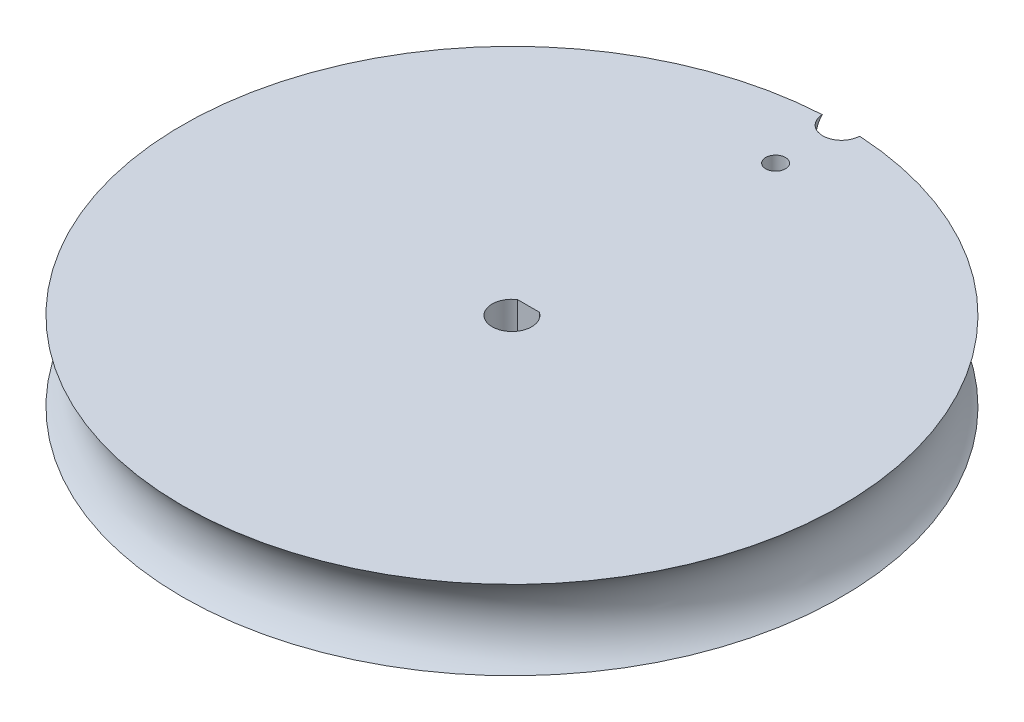
ISO-10303-21;
HEADER;
FILE_DESCRIPTION(('STEP AP214'),'2;1');
FILE_NAME('part.step','',(''),(''),'','','');
FILE_SCHEMA(('AUTOMOTIVE_DESIGN { 1 0 10303 214 1 1 1 1 }'));
ENDSEC;
DATA;
#1=APPLICATION_CONTEXT('core data for automotive mechanical design processes');
#2=APPLICATION_PROTOCOL_DEFINITION('international standard','automotive_design',2000,#1);
#3=PRODUCT_CONTEXT('',#1,'mechanical');
#4=PRODUCT('Part','Part','',(#3));
#5=PRODUCT_RELATED_PRODUCT_CATEGORY('part','',(#4));
#6=PRODUCT_DEFINITION_FORMATION('','',#4);
#7=PRODUCT_DEFINITION_CONTEXT('part definition',#1,'design');
#8=PRODUCT_DEFINITION('design','',#6,#7);
#9=PRODUCT_DEFINITION_SHAPE('','',#8);
#10=(LENGTH_UNIT() NAMED_UNIT(*) SI_UNIT(.MILLI.,.METRE.));
#11=(NAMED_UNIT(*) PLANE_ANGLE_UNIT() SI_UNIT($,.RADIAN.));
#12=(NAMED_UNIT(*) SI_UNIT($,.STERADIAN.) SOLID_ANGLE_UNIT());
#13=UNCERTAINTY_MEASURE_WITH_UNIT(LENGTH_MEASURE(1.E-05),#10,'distance_accuracy_value','');
#14=(GEOMETRIC_REPRESENTATION_CONTEXT(3) GLOBAL_UNCERTAINTY_ASSIGNED_CONTEXT((#13)) GLOBAL_UNIT_ASSIGNED_CONTEXT((#10,
#11,#12)) REPRESENTATION_CONTEXT('',''));
#15=CARTESIAN_POINT('',(0.,0.,0.));
#16=DIRECTION('',(0.,0.,1.));
#17=DIRECTION('',(1.,0.,0.));
#18=AXIS2_PLACEMENT_3D('',#15,#16,#17);
#19=CARTESIAN_POINT('',(0.,12.,-25.));
#20=DIRECTION('',(0.,-1.,0.));
#21=DIRECTION('',(0.,0.,-1.));
#22=AXIS2_PLACEMENT_3D('',#19,#20,#21);
#23=PLANE('',#22);
#24=CARTESIAN_POINT('',(0.,12.,-50.));
#25=DIRECTION('',(0.,-1.,0.));
#26=DIRECTION('',(0.,0.,-1.));
#27=AXIS2_PLACEMENT_3D('',#24,#25,#26);
#28=CIRCLE('',#27,2.82842712474619);
#29=CARTESIAN_POINT('',(2.82729552753158,12.,-49.92));
#30=VERTEX_POINT('',#29);
#31=CARTESIAN_POINT('',(-2.82729552753155,12.,-49.92));
#32=VERTEX_POINT('',#31);
#33=EDGE_CURVE('E47',#30,#32,#28,.T.);
#34=ORIENTED_EDGE('',*,*,#33,.T.);
#35=CARTESIAN_POINT('',(0.,12.,0.));
#36=DIRECTION('',(0.,1.,0.));
#37=DIRECTION('',(0.,0.,1.));
#38=AXIS2_PLACEMENT_3D('',#35,#36,#37);
#39=CIRCLE('',#38,50.);
#40=EDGE_CURVE('E11',#32,#30,#39,.T.);
#41=ORIENTED_EDGE('',*,*,#40,.T.);
#42=EDGE_LOOP('',(#34,#41));
#43=FACE_BOUND('',#42,.T.);
#44=CARTESIAN_POINT('',(0.,12.,0.));
#45=DIRECTION('',(0.,1.,0.));
#46=DIRECTION('',(0.,0.,1.));
#47=AXIS2_PLACEMENT_3D('',#44,#45,#46);
#48=CIRCLE('',#47,3.);
#49=CARTESIAN_POINT('',(-1.6583123951777,12.,-2.5));
#50=VERTEX_POINT('',#49);
#51=CARTESIAN_POINT('',(1.6583123951777,12.,-2.5));
#52=VERTEX_POINT('',#51);
#53=EDGE_CURVE('E101',#50,#52,#48,.T.);
#54=ORIENTED_EDGE('',*,*,#53,.F.);
#55=DIRECTION('',(-1.,0.,0.));
#56=VECTOR('',#55,1.);
#57=CARTESIAN_POINT('',(-1.6583123951777,12.,-2.5));
#58=LINE('',#57,#56);
#59=EDGE_CURVE('E99',#52,#50,#58,.T.);
#60=ORIENTED_EDGE('',*,*,#59,.F.);
#61=EDGE_LOOP('',(#54,#60));
#62=FACE_BOUND('',#61,.T.);
#63=CARTESIAN_POINT('',(0.,12.,-40.));
#64=DIRECTION('',(0.,1.,0.));
#65=DIRECTION('',(0.,0.,1.));
#66=AXIS2_PLACEMENT_3D('',#63,#64,#65);
#67=CIRCLE('',#66,1.5);
#68=CARTESIAN_POINT('',(0.,12.,-38.5));
#69=VERTEX_POINT('',#68);
#70=EDGE_CURVE('E106',#69,#69,#67,.T.);
#71=ORIENTED_EDGE('',*,*,#70,.F.);
#72=EDGE_LOOP('',(#71));
#73=FACE_BOUND('',#72,.T.);
#74=ADVANCED_FACE('F37',(#43,#62,#73),#23,.F.);
#75=CARTESIAN_POINT('',(0.,0.,-25.));
#76=DIRECTION('',(0.,-1.,0.));
#77=DIRECTION('',(0.,0.,-1.));
#78=AXIS2_PLACEMENT_3D('',#75,#76,#77);
#79=PLANE('',#78);
#80=DIRECTION('',(-1.,0.,0.));
#81=VECTOR('',#80,1.);
#82=CARTESIAN_POINT('',(-1.6583123951777,0.,-2.5));
#83=LINE('',#82,#81);
#84=CARTESIAN_POINT('',(1.6583123951777,0.,-2.5));
#85=VERTEX_POINT('',#84);
#86=CARTESIAN_POINT('',(-1.6583123951777,0.,-2.5));
#87=VERTEX_POINT('',#86);
#88=EDGE_CURVE('E104',#85,#87,#83,.T.);
#89=ORIENTED_EDGE('',*,*,#88,.T.);
#90=CARTESIAN_POINT('',(0.,0.,0.));
#91=DIRECTION('',(0.,1.,0.));
#92=DIRECTION('',(0.,0.,1.));
#93=AXIS2_PLACEMENT_3D('',#90,#91,#92);
#94=CIRCLE('',#93,3.);
#95=EDGE_CURVE('E62',#87,#85,#94,.T.);
#96=ORIENTED_EDGE('',*,*,#95,.T.);
#97=EDGE_LOOP('',(#89,#96));
#98=FACE_BOUND('',#97,.T.);
#99=CARTESIAN_POINT('',(0.,0.,-50.));
#100=DIRECTION('',(0.,-1.,0.));
#101=DIRECTION('',(0.,0.,-1.));
#102=AXIS2_PLACEMENT_3D('',#99,#100,#101);
#103=CIRCLE('',#102,2.82842712474619);
#104=CARTESIAN_POINT('',(2.82729552753107,1.46451706334647E-11,-49.9199999999824));
#105=VERTEX_POINT('',#104);
#106=CARTESIAN_POINT('',(-2.82729552753202,-1.3390667194499E-11,-49.9200000000161));
#107=VERTEX_POINT('',#106);
#108=EDGE_CURVE('E92',#105,#107,#103,.T.);
#109=ORIENTED_EDGE('',*,*,#108,.F.);
#110=CARTESIAN_POINT('',(0.,0.,0.));
#111=DIRECTION('',(0.,1.,0.));
#112=DIRECTION('',(0.,0.,1.));
#113=AXIS2_PLACEMENT_3D('',#110,#111,#112);
#114=CIRCLE('',#113,50.);
#115=EDGE_CURVE('E42',#107,#105,#114,.T.);
#116=ORIENTED_EDGE('',*,*,#115,.F.);
#117=EDGE_LOOP('',(#109,#116));
#118=FACE_BOUND('',#117,.T.);
#119=CARTESIAN_POINT('',(0.,0.,-40.));
#120=DIRECTION('',(0.,1.,0.));
#121=DIRECTION('',(0.,0.,1.));
#122=AXIS2_PLACEMENT_3D('',#119,#120,#121);
#123=CIRCLE('',#122,1.5);
#124=CARTESIAN_POINT('',(0.,0.,-38.5));
#125=VERTEX_POINT('',#124);
#126=EDGE_CURVE('E109',#125,#125,#123,.T.);
#127=ORIENTED_EDGE('',*,*,#126,.T.);
#128=EDGE_LOOP('',(#127));
#129=FACE_BOUND('',#128,.T.);
#130=ADVANCED_FACE('F138',(#98,#118,#129),#79,.T.);
#131=CARTESIAN_POINT('',(0.,12.,-50.));
#132=DIRECTION('',(0.,-1.,0.));
#133=DIRECTION('',(0.,0.,-1.));
#134=AXIS2_PLACEMENT_3D('',#131,#132,#133);
#135=CYLINDRICAL_SURFACE('',#134,2.82842712474619);
#136=ORIENTED_EDGE('',*,*,#33,.F.);
#137=CARTESIAN_POINT('',(2.82730117957037,12.0001666606854,-49.9202));
#138=CARTESIAN_POINT('',(2.82467800873692,11.9230816333861,-49.8276629496866));
#139=CARTESIAN_POINT('',(2.81759079335765,11.8438157081078,-49.7371726417749));
#140=CARTESIAN_POINT('',(2.79553453219514,11.6815820473777,-49.5608130642354));
#141=CARTESIAN_POINT('',(2.78057729256211,11.5986200267692,-49.4749370845646));
#142=CARTESIAN_POINT('',(2.74396487230876,11.43011825839,-49.3087429005541));
#143=CARTESIAN_POINT('',(2.72236596740647,11.3446054232879,-49.2283846896939));
#144=CARTESIAN_POINT('',(2.67330823467012,11.1707670758116,-49.0725862025407));
#145=CARTESIAN_POINT('',(2.64584630469365,11.0824400955965,-48.9971485574258));
#146=CARTESIAN_POINT('',(2.5688748759945,10.852673875435,-48.8099804536628));
#147=CARTESIAN_POINT('',(2.51568715148061,10.7094852645349,-48.7018920177948));
#148=CARTESIAN_POINT('',(2.39949795686554,10.4184752359719,-48.4979373879607));
#149=CARTESIAN_POINT('',(2.33649261265939,10.2706520079282,-48.4020760461691));
#150=CARTESIAN_POINT('',(2.20239371026164,9.97053602386539,-48.2217558166194));
#151=CARTESIAN_POINT('',(2.13125799185182,9.81822331861706,-48.1373618369392));
#152=CARTESIAN_POINT('',(1.98291124357602,9.51067446554975,-47.9801632431662));
#153=CARTESIAN_POINT('',(1.90570101011167,9.35543870298254,-47.9073571136149));
#154=CARTESIAN_POINT('',(1.74515133150489,9.03968565244982,-47.7716151348227));
#155=CARTESIAN_POINT('',(1.66172490687573,8.87912378772328,-47.7088868584722));
#156=CARTESIAN_POINT('',(1.49135394778709,8.55592962865483,-47.5945086515039));
#157=CARTESIAN_POINT('',(1.40440902008198,8.39329710428551,-47.542859963284));
#158=CARTESIAN_POINT('',(1.22864154016321,8.06682142071831,-47.4504400326701));
#159=CARTESIAN_POINT('',(1.13982728418251,7.90298511963663,-47.4096285915536));
#160=CARTESIAN_POINT('',(0.961631216459532,7.57346158772615,-47.3383363568861));
#161=CARTESIAN_POINT('',(0.872249597746717,7.40777497322772,-47.3078522234892));
#162=CARTESIAN_POINT('',(0.716830013222437,7.11325452290687,-47.2630292639522));
#163=CARTESIAN_POINT('',(0.650288748136903,6.9850120216874,-47.2465754983181));
#164=CARTESIAN_POINT('',(0.554446358788553,6.78966583664889,-47.2262519972178));
#165=CARTESIAN_POINT('',(0.52306321160219,6.72383034009916,-47.2201909277753));
#166=CARTESIAN_POINT('',(0.46311315298218,6.59081163257202,-47.2095796169804));
#167=CARTESIAN_POINT('',(0.434544965806035,6.52362904886466,-47.2050286889959));
#168=CARTESIAN_POINT('',(0.380905851602571,6.38158679280017,-47.1972001448699));
#169=CARTESIAN_POINT('',(0.356274393285745,6.30653458076376,-47.1940477558866));
#170=CARTESIAN_POINT('',(0.3299382591843,6.19201277362782,-47.1908674876201));
#171=CARTESIAN_POINT('',(0.322943517404748,6.15384026154741,-47.1900658847628));
#172=CARTESIAN_POINT('',(0.31347764820597,6.07694453507733,-47.1889939715536));
#173=CARTESIAN_POINT('',(0.311001104739854,6.03822203618276,-47.1887230250655));
#174=CARTESIAN_POINT('',(0.311044032645111,5.96034355141135,-47.1887277444755));
#175=CARTESIAN_POINT('',(0.313620026695008,5.92118758997531,-47.1890095945005));
#176=CARTESIAN_POINT('',(0.323370539516585,5.84344812908712,-47.1901147604332));
#177=CARTESIAN_POINT('',(0.330550597130337,5.80486537650461,-47.1909387285582));
#178=CARTESIAN_POINT('',(0.357526638849398,5.6890422020555,-47.1942044219954));
#179=CARTESIAN_POINT('',(0.382687940556079,5.61313489802838,-47.1974378429593));
#180=CARTESIAN_POINT('',(0.436521665158009,5.47167796691203,-47.205339568051));
#181=CARTESIAN_POINT('',(0.464581686469013,5.40585718733632,-47.2098296957091));
#182=CARTESIAN_POINT('',(0.523387299559219,5.2755240979855,-47.2202585200696));
#183=CARTESIAN_POINT('',(0.554133243175996,5.21101196100164,-47.2261974067326));
#184=CARTESIAN_POINT('',(0.648527550835361,5.01849716041232,-47.2461791286868));
#185=CARTESIAN_POINT('',(0.714233075389952,4.89174369191138,-47.2623738936148));
#186=CARTESIAN_POINT('',(0.846939293178797,4.64012242710984,-47.3004631822633));
#187=CARTESIAN_POINT('',(0.913937232751935,4.51525145528249,-47.3223466107597));
#188=CARTESIAN_POINT('',(1.0479187557456,4.26679158970468,-47.3718903819832));
#189=CARTESIAN_POINT('',(1.11490230777754,4.14320175026941,-47.399546089497));
#190=CARTESIAN_POINT('',(1.30308309217051,3.79527710126657,-47.4860607595336));
#191=CARTESIAN_POINT('',(1.42333443398909,3.57209535828519,-47.5518183368956));
#192=CARTESIAN_POINT('',(1.65767739088195,3.12929821757063,-47.7039887719167));
#193=CARTESIAN_POINT('',(1.77176441149122,2.90968556296212,-47.7904167825062));
#194=CARTESIAN_POINT('',(1.98977129264106,2.47639971184802,-47.9845566328943));
#195=CARTESIAN_POINT('',(2.09373994127859,2.2627019761139,-48.0921579159697));
#196=CARTESIAN_POINT('',(2.28803645192038,1.84185391452069,-48.3301283382237));
#197=CARTESIAN_POINT('',(2.37837346196961,1.63469927214286,-48.4604820806356));
#198=CARTESIAN_POINT('',(2.51042526878389,1.30352120789922,-48.6928985996615));
#199=CARTESIAN_POINT('',(2.55784299967097,1.17678850305716,-48.7878864230929));
#200=CARTESIAN_POINT('',(2.64318759517269,0.927890681251069,-48.9874156709757));
#201=CARTESIAN_POINT('',(2.68112424856907,0.805720965016346,-49.0919470885369));
#202=CARTESIAN_POINT('',(2.74580697731231,0.565554955549168,-49.3116761596059));
#203=CARTESIAN_POINT('',(2.77242927816567,0.447617131000154,-49.4269757576011));
#204=CARTESIAN_POINT('',(2.8016260786517,0.27575986411696,-49.6068135394916));
#205=CARTESIAN_POINT('',(2.80957323034835,0.219223783768015,-49.6680176088129));
#206=CARTESIAN_POINT('',(2.82150284229002,0.1080524561946,-49.7925546728896));
#207=CARTESIAN_POINT('',(2.82548332194968,0.0534181716744846,-49.8558887148564));
#208=CARTESIAN_POINT('',(2.8273011795704,-0.000166660685357238,-49.9202));
#209=B_SPLINE_CURVE_WITH_KNOTS('',3,(#137,#138,#139,#140,#141,#142,#143,#144,#145,#146,#147,
#148,#149,#150,#151,#152,#153,#154,#155,#156,#157,#158,#159,#160,#161,#162,#163,#164,#165,#166,
#167,#168,#169,#170,#171,#172,#173,#174,#175,#176,#177,#178,#179,#180,#181,#182,#183,#184,#185,
#186,#187,#188,#189,#190,#191,#192,#193,#194,#195,#196,#197,#198,#199,#200,#201,#202,#203,#204,
#205,#206,#207,#208),.UNSPECIFIED.,.F.,.F.,(4,2,2,2,2,2,2,2,2,2,2,2,2,2,2,2,2,2,2,2,2,2,2,2,2,2,
2,2,2,2,2,2,2,2,2,4),(0.,0.361163865956025,0.721787473240296,1.07943595249727,1.43727413558859,
1.9977714828897,2.55849056931263,3.12226185284519,3.68595934570406,4.26008770106516,
4.83428040208678,5.40631251188874,5.97815944981759,6.41421858546103,6.63370678703104,
6.85309505436098,7.08939840516778,7.205631896459,7.32172596476184,7.43912618495933,
7.5566679071947,7.79590237141506,8.01094332413162,8.22601248811255,8.65689516941663,
9.08694367743832,9.5166481705858,10.3014797181538,11.0868883773911,11.8682999143995,
12.649184699854,13.1446408032243,13.6395832375678,14.1398088515336,14.3907774711122,
14.6418713382755),.UNSPECIFIED.);
#210=EDGE_CURVE('E85',#30,#105,#209,.T.);
#211=ORIENTED_EDGE('',*,*,#210,.T.);
#212=ORIENTED_EDGE('',*,*,#108,.T.);
#213=CARTESIAN_POINT('',(-2.82730117957037,-0.000166660685359899,-49.9202));
#214=CARTESIAN_POINT('',(-2.82467800873691,0.0769183666138772,-49.8276629496866));
#215=CARTESIAN_POINT('',(-2.81759079335765,0.156184291892239,-49.7371726417749));
#216=CARTESIAN_POINT('',(-2.79553453219514,0.318417952622317,-49.5608130642354));
#217=CARTESIAN_POINT('',(-2.78057729256211,0.401379973230815,-49.4749370845646));
#218=CARTESIAN_POINT('',(-2.74396487230876,0.569881741609971,-49.3087429005541));
#219=CARTESIAN_POINT('',(-2.72236596740647,0.655394576712134,-49.2283846896939));
#220=CARTESIAN_POINT('',(-2.67330823467012,0.829232924188373,-49.0725862025407));
#221=CARTESIAN_POINT('',(-2.64584630469365,0.917559904403539,-48.9971485574258));
#222=CARTESIAN_POINT('',(-2.5688748759945,1.14732612456502,-48.8099804536628));
#223=CARTESIAN_POINT('',(-2.51568715148061,1.29051473546511,-48.7018920177948));
#224=CARTESIAN_POINT('',(-2.39949795686554,1.58152476402808,-48.4979373879607));
#225=CARTESIAN_POINT('',(-2.33649261265939,1.72934799207176,-48.4020760461691));
#226=CARTESIAN_POINT('',(-2.20239371026164,2.02946397613462,-48.2217558166194));
#227=CARTESIAN_POINT('',(-2.13125799185182,2.18177668138295,-48.1373618369392));
#228=CARTESIAN_POINT('',(-1.98291124357601,2.48932553445025,-47.9801632431662));
#229=CARTESIAN_POINT('',(-1.90570101011166,2.64456129701747,-47.9073571136149));
#230=CARTESIAN_POINT('',(-1.74515133150489,2.96031434755019,-47.7716151348227));
#231=CARTESIAN_POINT('',(-1.66172490687574,3.12087621227673,-47.7088868584722));
#232=CARTESIAN_POINT('',(-1.49135394778709,3.44407037134519,-47.5945086515039));
#233=CARTESIAN_POINT('',(-1.40440902008197,3.6067028957145,-47.542859963284));
#234=CARTESIAN_POINT('',(-1.22864154016319,3.9331785792817,-47.4504400326701));
#235=CARTESIAN_POINT('',(-1.13982728418248,4.09701488036338,-47.4096285915536));
#236=CARTESIAN_POINT('',(-0.961631216459507,4.42653841227387,-47.3383363568861));
#237=CARTESIAN_POINT('',(-0.872249597746696,4.59222502677231,-47.3078522234892));
#238=CARTESIAN_POINT('',(-0.71683001322242,4.88674547709316,-47.2630292639522));
#239=CARTESIAN_POINT('',(-0.650288748136888,5.01498797831263,-47.2465754983181));
#240=CARTESIAN_POINT('',(-0.554446358788542,5.21033416335113,-47.2262519972178));
#241=CARTESIAN_POINT('',(-0.52306321160218,5.27616965990087,-47.2201909277753));
#242=CARTESIAN_POINT('',(-0.46311315298217,5.409188367428,-47.2095796169804));
#243=CARTESIAN_POINT('',(-0.434544965806024,5.47637095113536,-47.2050286889959));
#244=CARTESIAN_POINT('',(-0.38090585160256,5.61841320719984,-47.1972001448699));
#245=CARTESIAN_POINT('',(-0.356274393285735,5.69346541923624,-47.1940477558866));
#246=CARTESIAN_POINT('',(-0.329938259184302,5.80798722637217,-47.1908674876201));
#247=CARTESIAN_POINT('',(-0.322943517404755,5.84615973845258,-47.1900658847628));
#248=CARTESIAN_POINT('',(-0.313477648205977,5.92305546492265,-47.1889939715536));
#249=CARTESIAN_POINT('',(-0.311001104739857,5.96177796381722,-47.1887230250655));
#250=CARTESIAN_POINT('',(-0.31104403264511,6.03965644858862,-47.1887277444755));
#251=CARTESIAN_POINT('',(-0.313620026695007,6.07881241002466,-47.1890095945005));
#252=CARTESIAN_POINT('',(-0.323370539516583,6.15655187091285,-47.1901147604332));
#253=CARTESIAN_POINT('',(-0.330550597130332,6.19513462349535,-47.1909387285582));
#254=CARTESIAN_POINT('',(-0.357526638849385,6.31095779794445,-47.1942044219954));
#255=CARTESIAN_POINT('',(-0.382687940556057,6.38686510197157,-47.1974378429593));
#256=CARTESIAN_POINT('',(-0.436521665157976,6.5283220330879,-47.205339568051));
#257=CARTESIAN_POINT('',(-0.464581686468976,6.59414281266361,-47.2098296957091));
#258=CARTESIAN_POINT('',(-0.523387299559174,6.72447590201441,-47.2202585200696));
#259=CARTESIAN_POINT('',(-0.554133243175947,6.78898803899827,-47.2261974067326));
#260=CARTESIAN_POINT('',(-0.648527550835301,6.98150283958757,-47.2461791286868));
#261=CARTESIAN_POINT('',(-0.714233075389884,7.1082563080885,-47.2623738936148));
#262=CARTESIAN_POINT('',(-0.846939293178715,7.35987757289002,-47.3004631822633));
#263=CARTESIAN_POINT('',(-0.913937232751845,7.48474854471735,-47.3223466107597));
#264=CARTESIAN_POINT('',(-1.0479187557455,7.73320841029514,-47.3718903819832));
#265=CARTESIAN_POINT('',(-1.11490230777743,7.8567982497304,-47.399546089497));
#266=CARTESIAN_POINT('',(-1.3030830921704,8.20472289873324,-47.4860607595335));
#267=CARTESIAN_POINT('',(-1.423334433989,8.42790464171462,-47.5518183368956));
#268=CARTESIAN_POINT('',(-1.65767739088187,8.87070178242921,-47.7039887719167));
#269=CARTESIAN_POINT('',(-1.77176441149115,9.09031443703773,-47.7904167825061));
#270=CARTESIAN_POINT('',(-1.98977129264099,9.52360028815186,-47.9845566328942));
#271=CARTESIAN_POINT('',(-2.09373994127853,9.73729802388599,-48.0921579159696));
#272=CARTESIAN_POINT('',(-2.28803645192033,10.1581460854792,-48.3301283382236));
#273=CARTESIAN_POINT('',(-2.37837346196958,10.3653007278571,-48.4604820806355));
#274=CARTESIAN_POINT('',(-2.51042526878386,10.6964787921007,-48.6928985996614));
#275=CARTESIAN_POINT('',(-2.55784299967095,10.8232114969428,-48.7878864230928));
#276=CARTESIAN_POINT('',(-2.64318759517268,11.0721093187489,-48.9874156709757));
#277=CARTESIAN_POINT('',(-2.68112424856906,11.1942790349836,-49.0919470885369));
#278=CARTESIAN_POINT('',(-2.74580697731231,11.4344450444508,-49.3116761596059));
#279=CARTESIAN_POINT('',(-2.77242927816567,11.5523828689998,-49.4269757576011));
#280=CARTESIAN_POINT('',(-2.8016260786517,11.724240135883,-49.6068135394916));
#281=CARTESIAN_POINT('',(-2.80957323034835,11.780776216232,-49.6680176088129));
#282=CARTESIAN_POINT('',(-2.82150284229002,11.8919475438054,-49.7925546728896));
#283=CARTESIAN_POINT('',(-2.82548332194968,11.9465818283255,-49.8558887148564));
#284=CARTESIAN_POINT('',(-2.8273011795704,12.0001666606854,-49.9202));
#285=B_SPLINE_CURVE_WITH_KNOTS('',3,(#213,#214,#215,#216,#217,#218,#219,#220,#221,#222,#223,
#224,#225,#226,#227,#228,#229,#230,#231,#232,#233,#234,#235,#236,#237,#238,#239,#240,#241,#242,
#243,#244,#245,#246,#247,#248,#249,#250,#251,#252,#253,#254,#255,#256,#257,#258,#259,#260,#261,
#262,#263,#264,#265,#266,#267,#268,#269,#270,#271,#272,#273,#274,#275,#276,#277,#278,#279,#280,
#281,#282,#283,#284),.UNSPECIFIED.,.F.,.F.,(4,2,2,2,2,2,2,2,2,2,2,2,2,2,2,2,2,2,2,2,2,2,2,2,2,2,
2,2,2,2,2,2,2,2,2,4),(0.,0.361163865956025,0.721787473240298,1.07943595249726,1.43727413558859,
1.9977714828897,2.55849056931264,3.1222618528452,3.68595934570406,4.26008770106517,
4.8342804020868,5.40631251188878,5.97815944981763,6.41421858546106,6.63370678703106,
6.853095054361,7.08939840516778,7.20563189645898,7.32172596476182,7.4391261849593,
7.55666790719465,7.79590237141499,8.01094332413153,8.22601248811244,8.65689516941647,
9.08694367743812,9.51664817058556,10.3014797181536,11.0868883773909,11.8682999143994,
12.6491846998539,13.1446408032243,13.6395832375678,14.1398088515335,14.3907774711121,
14.6418713382755),.UNSPECIFIED.);
#286=EDGE_CURVE('E82',#107,#32,#285,.T.);
#287=ORIENTED_EDGE('',*,*,#286,.T.);
#288=EDGE_LOOP('',(#136,#211,#212,#287));
#289=FACE_BOUND('',#288,.T.);
#290=ADVANCED_FACE('F39',(#289),#135,.F.);
#291=CARTESIAN_POINT('',(0.,12.,0.));
#292=DIRECTION('',(0.,-1.,0.));
#293=DIRECTION('',(0.,0.,-1.));
#294=AXIS2_PLACEMENT_3D('',#291,#292,#293);
#295=CYLINDRICAL_SURFACE('',#294,3.);
#296=ORIENTED_EDGE('',*,*,#95,.F.);
#297=DIRECTION('',(0.,-1.,0.));
#298=VECTOR('',#297,1.);
#299=CARTESIAN_POINT('',(-1.6583123951777,12.,-2.5));
#300=LINE('',#299,#298);
#301=EDGE_CURVE('E98',#50,#87,#300,.T.);
#302=ORIENTED_EDGE('',*,*,#301,.F.);
#303=ORIENTED_EDGE('',*,*,#53,.T.);
#304=DIRECTION('',(0.,-1.,0.));
#305=VECTOR('',#304,1.);
#306=CARTESIAN_POINT('',(1.6583123951777,12.,-2.5));
#307=LINE('',#306,#305);
#308=EDGE_CURVE('E55',#52,#85,#307,.T.);
#309=ORIENTED_EDGE('',*,*,#308,.T.);
#310=EDGE_LOOP('',(#296,#302,#303,#309));
#311=FACE_BOUND('',#310,.T.);
#312=ADVANCED_FACE('F134',(#311),#295,.F.);
#313=CARTESIAN_POINT('',(-1.6583123951777,12.,-2.5));
#314=DIRECTION('',(0.,0.,1.));
#315=DIRECTION('',(1.,0.,0.));
#316=AXIS2_PLACEMENT_3D('',#313,#314,#315);
#317=PLANE('',#316);
#318=ORIENTED_EDGE('',*,*,#88,.F.);
#319=ORIENTED_EDGE('',*,*,#308,.F.);
#320=ORIENTED_EDGE('',*,*,#59,.T.);
#321=ORIENTED_EDGE('',*,*,#301,.T.);
#322=EDGE_LOOP('',(#318,#319,#320,#321));
#323=FACE_BOUND('',#322,.T.);
#324=ADVANCED_FACE('F130',(#323),#317,.T.);
#325=CARTESIAN_POINT('',(0.,12.,-40.));
#326=DIRECTION('',(0.,-1.,0.));
#327=DIRECTION('',(0.,0.,-1.));
#328=AXIS2_PLACEMENT_3D('',#325,#326,#327);
#329=CYLINDRICAL_SURFACE('',#328,1.5);
#330=ORIENTED_EDGE('',*,*,#70,.T.);
#331=EDGE_LOOP('',(#330));
#332=FACE_BOUND('',#331,.T.);
#333=ORIENTED_EDGE('',*,*,#126,.F.);
#334=EDGE_LOOP('',(#333));
#335=FACE_BOUND('',#334,.T.);
#336=ADVANCED_FACE('F126',(#332,#335),#329,.F.);
#337=CARTESIAN_POINT('',(0.,6.,0.));
#338=DIRECTION('',(0.,-1.,0.));
#339=DIRECTION('',(0.,0.,-1.));
#340=AXIS2_PLACEMENT_3D('',#337,#338,#339);
#341=TOROIDAL_SURFACE('',#340,55.,7.81024967590665);
#342=ORIENTED_EDGE('',*,*,#115,.T.);
#343=ORIENTED_EDGE('',*,*,#210,.F.);
#344=ORIENTED_EDGE('',*,*,#40,.F.);
#345=ORIENTED_EDGE('',*,*,#286,.F.);
#346=EDGE_LOOP('',(#342,#343,#344,#345));
#347=FACE_BOUND('',#346,.T.);
#348=ADVANCED_FACE('F81',(#347),#341,.F.);
#349=CLOSED_SHELL('',(#74,#130,#290,#312,#324,#336,#348));
#350=MANIFOLD_SOLID_BREP('B2',#349);
#351=ADVANCED_BREP_SHAPE_REPRESENTATION('',(#18,#350),#14);
#352=SHAPE_DEFINITION_REPRESENTATION(#9,#351);
ENDSEC;
END-ISO-10303-21;
